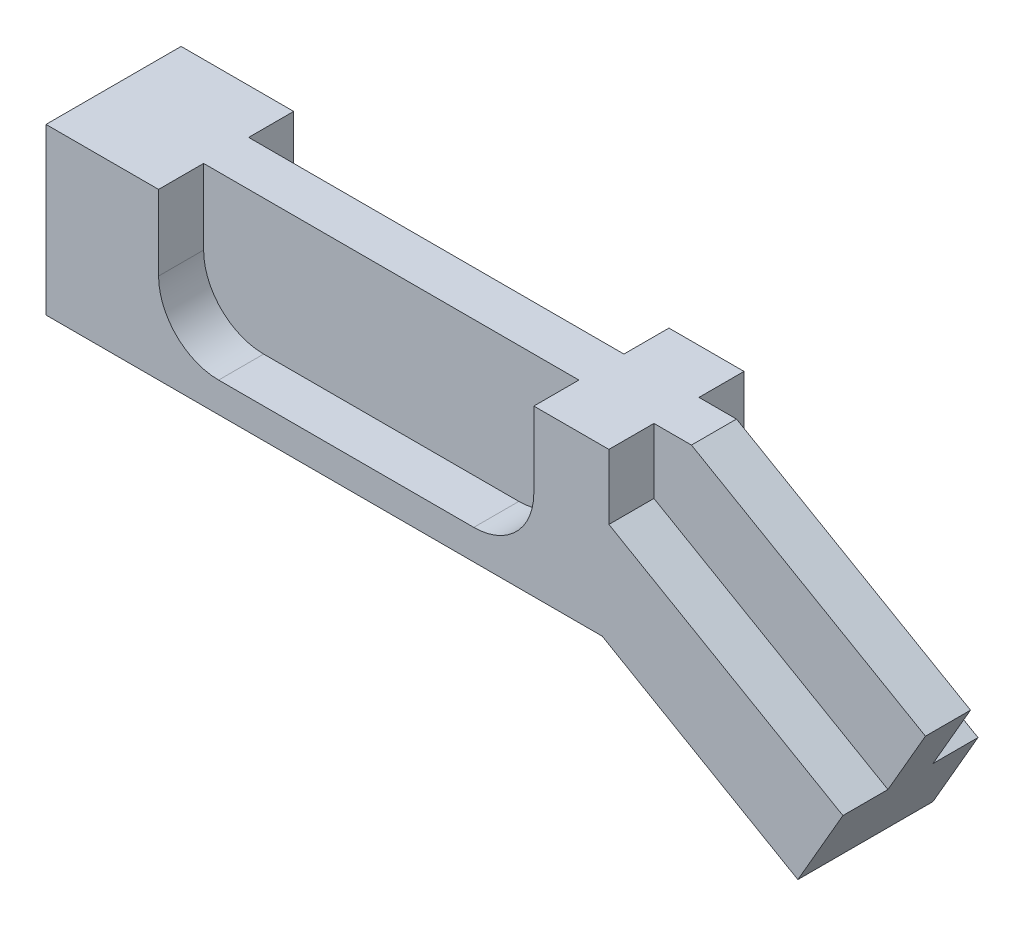
ISO-10303-21;
HEADER;
FILE_DESCRIPTION(('STEP AP214'),'2;1');
FILE_NAME('part.step','',(''),(''),'','','');
FILE_SCHEMA(('AUTOMOTIVE_DESIGN { 1 0 10303 214 1 1 1 1 }'));
ENDSEC;
DATA;
#1=APPLICATION_CONTEXT('core data for automotive mechanical design processes');
#2=APPLICATION_PROTOCOL_DEFINITION('international standard','automotive_design',2000,#1);
#3=PRODUCT_CONTEXT('',#1,'mechanical');
#4=PRODUCT('Part','Part','',(#3));
#5=PRODUCT_RELATED_PRODUCT_CATEGORY('part','',(#4));
#6=PRODUCT_DEFINITION_FORMATION('','',#4);
#7=PRODUCT_DEFINITION_CONTEXT('part definition',#1,'design');
#8=PRODUCT_DEFINITION('design','',#6,#7);
#9=PRODUCT_DEFINITION_SHAPE('','',#8);
#10=(LENGTH_UNIT() NAMED_UNIT(*) SI_UNIT(.MILLI.,.METRE.));
#11=(NAMED_UNIT(*) PLANE_ANGLE_UNIT() SI_UNIT($,.RADIAN.));
#12=(NAMED_UNIT(*) SI_UNIT($,.STERADIAN.) SOLID_ANGLE_UNIT());
#13=UNCERTAINTY_MEASURE_WITH_UNIT(LENGTH_MEASURE(1.E-05),#10,'distance_accuracy_value','');
#14=(GEOMETRIC_REPRESENTATION_CONTEXT(3) GLOBAL_UNCERTAINTY_ASSIGNED_CONTEXT((#13)) GLOBAL_UNIT_ASSIGNED_CONTEXT((#10,
#11,#12)) REPRESENTATION_CONTEXT('',''));
#15=CARTESIAN_POINT('',(0.,0.,0.));
#16=DIRECTION('',(0.,0.,1.));
#17=DIRECTION('',(1.,0.,0.));
#18=AXIS2_PLACEMENT_3D('',#15,#16,#17);
#19=CARTESIAN_POINT('',(15.0000000000001,25.9807621135332,9.));
#20=DIRECTION('',(-0.500000000000001,-0.866025403784438,0.));
#21=DIRECTION('',(0.866025403784438,-0.500000000000001,0.));
#22=AXIS2_PLACEMENT_3D('',#19,#20,#21);
#23=PLANE('',#22);
#24=DIRECTION('',(-0.866025403784438,0.500000000000001,0.));
#25=VECTOR('',#24,1.);
#26=CARTESIAN_POINT('',(15.0000000000001,25.9807621135332,-3.));
#27=LINE('',#26,#25);
#28=CARTESIAN_POINT('',(106.17691453624,-26.6602540378444,-3.));
#29=VERTEX_POINT('',#28);
#30=CARTESIAN_POINT('',(75.,-8.66025403784439,-3.));
#31=VERTEX_POINT('',#30);
#32=EDGE_CURVE('E462',#29,#31,#27,.T.);
#33=ORIENTED_EDGE('',*,*,#32,.F.);
#34=DIRECTION('',(0.,0.,-1.));
#35=VECTOR('',#34,1.);
#36=CARTESIAN_POINT('',(106.17691453624,-26.6602540378444,9.));
#37=LINE('',#36,#35);
#38=CARTESIAN_POINT('',(106.17691453624,-26.6602540378444,-9.));
#39=VERTEX_POINT('',#38);
#40=EDGE_CURVE('E222',#29,#39,#37,.T.);
#41=ORIENTED_EDGE('',*,*,#40,.T.);
#42=DIRECTION('',(-0.866025403784438,0.500000000000001,0.));
#43=VECTOR('',#42,1.);
#44=CARTESIAN_POINT('',(15.0000000000001,25.9807621135332,-9.));
#45=LINE('',#44,#43);
#46=CARTESIAN_POINT('',(75.,-8.66025403784439,-9.));
#47=VERTEX_POINT('',#46);
#48=EDGE_CURVE('E289',#39,#47,#45,.T.);
#49=ORIENTED_EDGE('',*,*,#48,.T.);
#50=DIRECTION('',(0.,0.,-1.));
#51=VECTOR('',#50,1.);
#52=CARTESIAN_POINT('',(75.,-8.66025403784439,9.));
#53=LINE('',#52,#51);
#54=EDGE_CURVE('E308',#31,#47,#53,.T.);
#55=ORIENTED_EDGE('',*,*,#54,.F.);
#56=EDGE_LOOP('',(#33,#41,#49,#55));
#57=FACE_BOUND('',#56,.T.);
#58=ADVANCED_FACE('F32',(#57),#23,.F.);
#59=CARTESIAN_POINT('',(75.,0.,9.));
#60=DIRECTION('',(1.,0.,0.));
#61=DIRECTION('',(0.,0.,-1.));
#62=AXIS2_PLACEMENT_3D('',#59,#60,#61);
#63=PLANE('',#62);
#64=DIRECTION('',(0.,0.,-1.));
#65=VECTOR('',#64,1.);
#66=CARTESIAN_POINT('',(75.,0.,9.));
#67=LINE('',#66,#65);
#68=CARTESIAN_POINT('',(75.,0.,-3.));
#69=VERTEX_POINT('',#68);
#70=CARTESIAN_POINT('',(75.,0.,-9.));
#71=VERTEX_POINT('',#70);
#72=EDGE_CURVE('E305',#69,#71,#67,.T.);
#73=ORIENTED_EDGE('',*,*,#72,.F.);
#74=DIRECTION('',(0.,-1.,0.));
#75=VECTOR('',#74,1.);
#76=CARTESIAN_POINT('',(75.,0.,-3.));
#77=LINE('',#76,#75);
#78=EDGE_CURVE('E206',#69,#31,#77,.T.);
#79=ORIENTED_EDGE('',*,*,#78,.T.);
#80=ORIENTED_EDGE('',*,*,#54,.T.);
#81=DIRECTION('',(0.,-1.,0.));
#82=VECTOR('',#81,1.);
#83=CARTESIAN_POINT('',(75.,0.,-9.));
#84=LINE('',#83,#82);
#85=EDGE_CURVE('E292',#71,#47,#84,.T.);
#86=ORIENTED_EDGE('',*,*,#85,.F.);
#87=EDGE_LOOP('',(#73,#79,#80,#86));
#88=FACE_BOUND('',#87,.T.);
#89=ADVANCED_FACE('F319',(#88),#63,.T.);
#90=CARTESIAN_POINT('',(57.,-10.,9.));
#91=DIRECTION('',(0.,0.,-1.));
#92=DIRECTION('',(-1.,0.,0.));
#93=AXIS2_PLACEMENT_3D('',#90,#91,#92);
#94=CYLINDRICAL_SURFACE('',#93,8.);
#95=DIRECTION('',(0.,0.,-1.));
#96=VECTOR('',#95,1.);
#97=CARTESIAN_POINT('',(56.9999999999999,-18.,9.));
#98=LINE('',#97,#96);
#99=CARTESIAN_POINT('',(56.9999999999999,-18.,-3.));
#100=VERTEX_POINT('',#99);
#101=CARTESIAN_POINT('',(56.9999999999999,-18.,-9.));
#102=VERTEX_POINT('',#101);
#103=EDGE_CURVE('E40',#100,#102,#98,.T.);
#104=ORIENTED_EDGE('',*,*,#103,.F.);
#105=CARTESIAN_POINT('',(57.,-10.,-3.));
#106=DIRECTION('',(0.,0.,1.));
#107=DIRECTION('',(1.,0.,0.));
#108=AXIS2_PLACEMENT_3D('',#105,#106,#107);
#109=CIRCLE('',#108,8.);
#110=CARTESIAN_POINT('',(65.,-9.99999999999994,-3.));
#111=VERTEX_POINT('',#110);
#112=EDGE_CURVE('E338',#100,#111,#109,.T.);
#113=ORIENTED_EDGE('',*,*,#112,.T.);
#114=DIRECTION('',(0.,0.,-1.));
#115=VECTOR('',#114,1.);
#116=CARTESIAN_POINT('',(65.,-9.99999999999994,9.));
#117=LINE('',#116,#115);
#118=CARTESIAN_POINT('',(65.,-9.99999999999994,-9.));
#119=VERTEX_POINT('',#118);
#120=EDGE_CURVE('E303',#111,#119,#117,.T.);
#121=ORIENTED_EDGE('',*,*,#120,.T.);
#122=CARTESIAN_POINT('',(57.,-10.,-9.));
#123=DIRECTION('',(0.,0.,1.));
#124=DIRECTION('',(1.,0.,0.));
#125=AXIS2_PLACEMENT_3D('',#122,#123,#124);
#126=CIRCLE('',#125,8.);
#127=EDGE_CURVE('E265',#102,#119,#126,.T.);
#128=ORIENTED_EDGE('',*,*,#127,.F.);
#129=EDGE_LOOP('',(#104,#113,#121,#128));
#130=FACE_BOUND('',#129,.T.);
#131=ADVANCED_FACE('F383',(#130),#94,.F.);
#132=CARTESIAN_POINT('',(0.,-18.,9.));
#133=DIRECTION('',(0.,1.,0.));
#134=DIRECTION('',(-1.,0.,0.));
#135=AXIS2_PLACEMENT_3D('',#132,#133,#134);
#136=PLANE('',#135);
#137=DIRECTION('',(0.,0.,-1.));
#138=VECTOR('',#137,1.);
#139=CARTESIAN_POINT('',(23.0000000000001,-18.,9.));
#140=LINE('',#139,#138);
#141=CARTESIAN_POINT('',(23.0000000000001,-18.,-3.));
#142=VERTEX_POINT('',#141);
#143=CARTESIAN_POINT('',(23.0000000000001,-18.,-9.));
#144=VERTEX_POINT('',#143);
#145=EDGE_CURVE('E243',#142,#144,#140,.T.);
#146=ORIENTED_EDGE('',*,*,#145,.F.);
#147=DIRECTION('',(1.,0.,0.));
#148=VECTOR('',#147,1.);
#149=CARTESIAN_POINT('',(0.,-18.,-3.));
#150=LINE('',#149,#148);
#151=EDGE_CURVE('E55',#142,#100,#150,.T.);
#152=ORIENTED_EDGE('',*,*,#151,.T.);
#153=ORIENTED_EDGE('',*,*,#103,.T.);
#154=DIRECTION('',(1.,0.,0.));
#155=VECTOR('',#154,1.);
#156=CARTESIAN_POINT('',(0.,-18.,-9.));
#157=LINE('',#156,#155);
#158=EDGE_CURVE('E260',#144,#102,#157,.T.);
#159=ORIENTED_EDGE('',*,*,#158,.F.);
#160=EDGE_LOOP('',(#146,#152,#153,#159));
#161=FACE_BOUND('',#160,.T.);
#162=ADVANCED_FACE('F261',(#161),#136,.T.);
#163=CARTESIAN_POINT('',(23.,-10.,9.));
#164=DIRECTION('',(0.,0.,-1.));
#165=DIRECTION('',(-1.,0.,0.));
#166=AXIS2_PLACEMENT_3D('',#163,#164,#165);
#167=CYLINDRICAL_SURFACE('',#166,8.);
#168=DIRECTION('',(0.,0.,-1.));
#169=VECTOR('',#168,1.);
#170=CARTESIAN_POINT('',(15.,-9.99999999999994,9.));
#171=LINE('',#170,#169);
#172=CARTESIAN_POINT('',(15.,-9.99999999999994,-3.));
#173=VERTEX_POINT('',#172);
#174=CARTESIAN_POINT('',(15.,-9.99999999999994,-9.));
#175=VERTEX_POINT('',#174);
#176=EDGE_CURVE('E240',#173,#175,#171,.T.);
#177=ORIENTED_EDGE('',*,*,#176,.F.);
#178=CARTESIAN_POINT('',(23.,-10.,-3.));
#179=DIRECTION('',(0.,0.,1.));
#180=DIRECTION('',(1.,0.,0.));
#181=AXIS2_PLACEMENT_3D('',#178,#179,#180);
#182=CIRCLE('',#181,8.);
#183=EDGE_CURVE('E258',#173,#142,#182,.T.);
#184=ORIENTED_EDGE('',*,*,#183,.T.);
#185=ORIENTED_EDGE('',*,*,#145,.T.);
#186=CARTESIAN_POINT('',(23.,-10.,-9.));
#187=DIRECTION('',(0.,0.,1.));
#188=DIRECTION('',(1.,0.,0.));
#189=AXIS2_PLACEMENT_3D('',#186,#187,#188);
#190=CIRCLE('',#189,8.);
#191=EDGE_CURVE('E255',#175,#144,#190,.T.);
#192=ORIENTED_EDGE('',*,*,#191,.F.);
#193=EDGE_LOOP('',(#177,#184,#185,#192));
#194=FACE_BOUND('',#193,.T.);
#195=ADVANCED_FACE('F253',(#194),#167,.F.);
#196=CARTESIAN_POINT('',(15.,0.,9.));
#197=DIRECTION('',(1.,0.,0.));
#198=DIRECTION('',(0.,1.,0.));
#199=AXIS2_PLACEMENT_3D('',#196,#197,#198);
#200=PLANE('',#199);
#201=DIRECTION('',(0.,0.,-1.));
#202=VECTOR('',#201,1.);
#203=CARTESIAN_POINT('',(15.,0.,9.));
#204=LINE('',#203,#202);
#205=CARTESIAN_POINT('',(15.,0.,-3.));
#206=VERTEX_POINT('',#205);
#207=CARTESIAN_POINT('',(15.,0.,-9.));
#208=VERTEX_POINT('',#207);
#209=EDGE_CURVE('E236',#206,#208,#204,.T.);
#210=ORIENTED_EDGE('',*,*,#209,.F.);
#211=DIRECTION('',(0.,-1.,0.));
#212=VECTOR('',#211,1.);
#213=CARTESIAN_POINT('',(15.,0.,-3.));
#214=LINE('',#213,#212);
#215=EDGE_CURVE('E335',#206,#173,#214,.T.);
#216=ORIENTED_EDGE('',*,*,#215,.T.);
#217=ORIENTED_EDGE('',*,*,#176,.T.);
#218=DIRECTION('',(0.,-1.,0.));
#219=VECTOR('',#218,1.);
#220=CARTESIAN_POINT('',(15.,0.,-9.));
#221=LINE('',#220,#219);
#222=EDGE_CURVE('E270',#208,#175,#221,.T.);
#223=ORIENTED_EDGE('',*,*,#222,.F.);
#224=EDGE_LOOP('',(#210,#216,#217,#223));
#225=FACE_BOUND('',#224,.T.);
#226=ADVANCED_FACE('F427',(#225),#200,.T.);
#227=CARTESIAN_POINT('',(65.,0.,9.));
#228=DIRECTION('',(1.,0.,0.));
#229=DIRECTION('',(0.,0.,-1.));
#230=AXIS2_PLACEMENT_3D('',#227,#228,#229);
#231=PLANE('',#230);
#232=DIRECTION('',(0.,-1.,0.));
#233=VECTOR('',#232,1.);
#234=CARTESIAN_POINT('',(65.,0.,-3.));
#235=LINE('',#234,#233);
#236=CARTESIAN_POINT('',(65.,0.,-3.));
#237=VERTEX_POINT('',#236);
#238=EDGE_CURVE('E327',#237,#111,#235,.T.);
#239=ORIENTED_EDGE('',*,*,#238,.F.);
#240=DIRECTION('',(0.,0.,-1.));
#241=VECTOR('',#240,1.);
#242=CARTESIAN_POINT('',(65.,0.,9.));
#243=LINE('',#242,#241);
#244=CARTESIAN_POINT('',(65.,0.,-9.));
#245=VERTEX_POINT('',#244);
#246=EDGE_CURVE('E302',#237,#245,#243,.T.);
#247=ORIENTED_EDGE('',*,*,#246,.T.);
#248=DIRECTION('',(0.,-1.,0.));
#249=VECTOR('',#248,1.);
#250=CARTESIAN_POINT('',(65.,0.,-9.));
#251=LINE('',#250,#249);
#252=EDGE_CURVE('E295',#245,#119,#251,.T.);
#253=ORIENTED_EDGE('',*,*,#252,.T.);
#254=ORIENTED_EDGE('',*,*,#120,.F.);
#255=EDGE_LOOP('',(#239,#247,#253,#254));
#256=FACE_BOUND('',#255,.T.);
#257=ADVANCED_FACE('F324',(#256),#231,.F.);
#258=CARTESIAN_POINT('',(57.,-10.,3.));
#259=DIRECTION('',(0.,0.,1.));
#260=DIRECTION('',(1.,0.,0.));
#261=AXIS2_PLACEMENT_3D('',#258,#259,#260);
#262=CIRCLE('',#261,8.);
#263=CARTESIAN_POINT('',(56.9999999999999,-18.,3.));
#264=VERTEX_POINT('',#263);
#265=CARTESIAN_POINT('',(65.,-9.99999999999994,3.));
#266=VERTEX_POINT('',#265);
#267=EDGE_CURVE('E435',#264,#266,#262,.T.);
#268=ORIENTED_EDGE('',*,*,#267,.F.);
#269=CARTESIAN_POINT('',(56.9999999999999,-18.,9.));
#270=VERTEX_POINT('',#269);
#271=EDGE_CURVE('E11',#270,#264,#98,.T.);
#272=ORIENTED_EDGE('',*,*,#271,.F.);
#273=CARTESIAN_POINT('',(57.,-10.,9.));
#274=DIRECTION('',(0.,0.,1.));
#275=DIRECTION('',(1.,0.,0.));
#276=AXIS2_PLACEMENT_3D('',#273,#274,#275);
#277=CIRCLE('',#276,8.);
#278=CARTESIAN_POINT('',(65.,-9.99999999999994,9.));
#279=VERTEX_POINT('',#278);
#280=EDGE_CURVE('E298',#270,#279,#277,.T.);
#281=ORIENTED_EDGE('',*,*,#280,.T.);
#282=EDGE_CURVE('E299',#279,#266,#117,.T.);
#283=ORIENTED_EDGE('',*,*,#282,.T.);
#284=EDGE_LOOP('',(#268,#272,#281,#283));
#285=FACE_BOUND('',#284,.T.);
#286=ADVANCED_FACE('F34',(#285),#94,.F.);
#287=DIRECTION('',(1.,0.,0.));
#288=VECTOR('',#287,1.);
#289=CARTESIAN_POINT('',(0.,-18.,3.));
#290=LINE('',#289,#288);
#291=CARTESIAN_POINT('',(23.0000000000001,-18.,3.));
#292=VERTEX_POINT('',#291);
#293=EDGE_CURVE('E343',#292,#264,#290,.T.);
#294=ORIENTED_EDGE('',*,*,#293,.F.);
#295=CARTESIAN_POINT('',(23.0000000000001,-18.,9.));
#296=VERTEX_POINT('',#295);
#297=EDGE_CURVE('E244',#296,#292,#140,.T.);
#298=ORIENTED_EDGE('',*,*,#297,.F.);
#299=DIRECTION('',(1.,0.,0.));
#300=VECTOR('',#299,1.);
#301=CARTESIAN_POINT('',(0.,-18.,9.));
#302=LINE('',#301,#300);
#303=EDGE_CURVE('E346',#296,#270,#302,.T.);
#304=ORIENTED_EDGE('',*,*,#303,.T.);
#305=ORIENTED_EDGE('',*,*,#271,.T.);
#306=EDGE_LOOP('',(#294,#298,#304,#305));
#307=FACE_BOUND('',#306,.T.);
#308=ADVANCED_FACE('F389',(#307),#136,.T.);
#309=CARTESIAN_POINT('',(23.,-10.,3.));
#310=DIRECTION('',(0.,0.,1.));
#311=DIRECTION('',(1.,0.,0.));
#312=AXIS2_PLACEMENT_3D('',#309,#310,#311);
#313=CIRCLE('',#312,8.);
#314=CARTESIAN_POINT('',(15.,-9.99999999999994,3.));
#315=VERTEX_POINT('',#314);
#316=EDGE_CURVE('E372',#315,#292,#313,.T.);
#317=ORIENTED_EDGE('',*,*,#316,.F.);
#318=CARTESIAN_POINT('',(15.,-9.99999999999994,9.));
#319=VERTEX_POINT('',#318);
#320=EDGE_CURVE('E241',#319,#315,#171,.T.);
#321=ORIENTED_EDGE('',*,*,#320,.F.);
#322=CARTESIAN_POINT('',(23.,-10.,9.));
#323=DIRECTION('',(0.,0.,1.));
#324=DIRECTION('',(1.,0.,0.));
#325=AXIS2_PLACEMENT_3D('',#322,#323,#324);
#326=CIRCLE('',#325,8.);
#327=EDGE_CURVE('E349',#319,#296,#326,.T.);
#328=ORIENTED_EDGE('',*,*,#327,.T.);
#329=ORIENTED_EDGE('',*,*,#297,.T.);
#330=EDGE_LOOP('',(#317,#321,#328,#329));
#331=FACE_BOUND('',#330,.T.);
#332=ADVANCED_FACE('F425',(#331),#167,.F.);
#333=DIRECTION('',(0.,-1.,0.));
#334=VECTOR('',#333,1.);
#335=CARTESIAN_POINT('',(15.,0.,3.));
#336=LINE('',#335,#334);
#337=CARTESIAN_POINT('',(15.,0.,3.));
#338=VERTEX_POINT('',#337);
#339=EDGE_CURVE('E373',#338,#315,#336,.T.);
#340=ORIENTED_EDGE('',*,*,#339,.F.);
#341=CARTESIAN_POINT('',(15.,0.,9.));
#342=VERTEX_POINT('',#341);
#343=EDGE_CURVE('E237',#342,#338,#204,.T.);
#344=ORIENTED_EDGE('',*,*,#343,.F.);
#345=DIRECTION('',(0.,-1.,0.));
#346=VECTOR('',#345,1.);
#347=CARTESIAN_POINT('',(15.,0.,9.));
#348=LINE('',#347,#346);
#349=EDGE_CURVE('E351',#342,#319,#348,.T.);
#350=ORIENTED_EDGE('',*,*,#349,.T.);
#351=ORIENTED_EDGE('',*,*,#320,.T.);
#352=EDGE_LOOP('',(#340,#344,#350,#351));
#353=FACE_BOUND('',#352,.T.);
#354=ADVANCED_FACE('F421',(#353),#200,.T.);
#355=CARTESIAN_POINT('',(0.,0.,9.));
#356=DIRECTION('',(1.,0.,0.));
#357=DIRECTION('',(0.,1.,0.));
#358=AXIS2_PLACEMENT_3D('',#355,#356,#357);
#359=PLANE('',#358);
#360=DIRECTION('',(0.,-1.,0.));
#361=VECTOR('',#360,1.);
#362=CARTESIAN_POINT('',(0.,0.,-9.));
#363=LINE('',#362,#361);
#364=CARTESIAN_POINT('',(0.,0.,-9.));
#365=VERTEX_POINT('',#364);
#366=CARTESIAN_POINT('',(0.,-22.,-9.));
#367=VERTEX_POINT('',#366);
#368=EDGE_CURVE('E277',#365,#367,#363,.T.);
#369=ORIENTED_EDGE('',*,*,#368,.T.);
#370=DIRECTION('',(0.,0.,-1.));
#371=VECTOR('',#370,1.);
#372=CARTESIAN_POINT('',(0.,-22.,9.));
#373=LINE('',#372,#371);
#374=CARTESIAN_POINT('',(0.,-22.,9.));
#375=VERTEX_POINT('',#374);
#376=EDGE_CURVE('E231',#375,#367,#373,.T.);
#377=ORIENTED_EDGE('',*,*,#376,.F.);
#378=DIRECTION('',(0.,-1.,0.));
#379=VECTOR('',#378,1.);
#380=CARTESIAN_POINT('',(0.,0.,9.));
#381=LINE('',#380,#379);
#382=CARTESIAN_POINT('',(0.,0.,9.));
#383=VERTEX_POINT('',#382);
#384=EDGE_CURVE('E357',#383,#375,#381,.T.);
#385=ORIENTED_EDGE('',*,*,#384,.F.);
#386=DIRECTION('',(0.,0.,-1.));
#387=VECTOR('',#386,1.);
#388=CARTESIAN_POINT('',(0.,0.,9.));
#389=LINE('',#388,#387);
#390=EDGE_CURVE('E234',#383,#365,#389,.T.);
#391=ORIENTED_EDGE('',*,*,#390,.T.);
#392=EDGE_LOOP('',(#369,#377,#385,#391));
#393=FACE_BOUND('',#392,.T.);
#394=ADVANCED_FACE('F417',(#393),#359,.F.);
#395=CARTESIAN_POINT('',(0.,-22.,9.));
#396=DIRECTION('',(0.,1.,0.));
#397=DIRECTION('',(-1.,0.,0.));
#398=AXIS2_PLACEMENT_3D('',#395,#396,#397);
#399=PLANE('',#398);
#400=DIRECTION('',(1.,0.,0.));
#401=VECTOR('',#400,1.);
#402=CARTESIAN_POINT('',(0.,-22.,-9.));
#403=LINE('',#402,#401);
#404=CARTESIAN_POINT('',(74.1051177665152,-22.,-9.));
#405=VERTEX_POINT('',#404);
#406=EDGE_CURVE('E280',#367,#405,#403,.T.);
#407=ORIENTED_EDGE('',*,*,#406,.T.);
#408=DIRECTION('',(0.,0.,-1.));
#409=VECTOR('',#408,1.);
#410=CARTESIAN_POINT('',(74.1051177665152,-22.,9.));
#411=LINE('',#410,#409);
#412=CARTESIAN_POINT('',(74.1051177665152,-22.,9.));
#413=VERTEX_POINT('',#412);
#414=EDGE_CURVE('E224',#413,#405,#411,.T.);
#415=ORIENTED_EDGE('',*,*,#414,.F.);
#416=DIRECTION('',(1.,0.,0.));
#417=VECTOR('',#416,1.);
#418=CARTESIAN_POINT('',(0.,-22.,9.));
#419=LINE('',#418,#417);
#420=EDGE_CURVE('E360',#375,#413,#419,.T.);
#421=ORIENTED_EDGE('',*,*,#420,.F.);
#422=ORIENTED_EDGE('',*,*,#376,.T.);
#423=EDGE_LOOP('',(#407,#415,#421,#422));
#424=FACE_BOUND('',#423,.T.);
#425=ADVANCED_FACE('F411',(#424),#399,.F.);
#426=CARTESIAN_POINT('',(8.99999999999995,15.5884572681198,9.));
#427=DIRECTION('',(-0.5,-0.866025403784439,0.));
#428=DIRECTION('',(0.866025403784439,-0.5,0.));
#429=AXIS2_PLACEMENT_3D('',#426,#427,#428);
#430=PLANE('',#429);
#431=DIRECTION('',(-0.866025403784439,0.5,0.));
#432=VECTOR('',#431,1.);
#433=CARTESIAN_POINT('',(8.99999999999995,15.5884572681198,-9.));
#434=LINE('',#433,#432);
#435=CARTESIAN_POINT('',(100.17691453624,-37.0525588832577,-9.));
#436=VERTEX_POINT('',#435);
#437=EDGE_CURVE('E283',#436,#405,#434,.T.);
#438=ORIENTED_EDGE('',*,*,#437,.F.);
#439=DIRECTION('',(0.,0.,-1.));
#440=VECTOR('',#439,1.);
#441=CARTESIAN_POINT('',(100.17691453624,-37.0525588832577,9.));
#442=LINE('',#441,#440);
#443=CARTESIAN_POINT('',(100.17691453624,-37.0525588832577,9.));
#444=VERTEX_POINT('',#443);
#445=EDGE_CURVE('E221',#444,#436,#442,.T.);
#446=ORIENTED_EDGE('',*,*,#445,.F.);
#447=DIRECTION('',(-0.866025403784439,0.5,0.));
#448=VECTOR('',#447,1.);
#449=CARTESIAN_POINT('',(8.99999999999995,15.5884572681198,9.));
#450=LINE('',#449,#448);
#451=EDGE_CURVE('E362',#444,#413,#450,.T.);
#452=ORIENTED_EDGE('',*,*,#451,.T.);
#453=ORIENTED_EDGE('',*,*,#414,.T.);
#454=EDGE_LOOP('',(#438,#446,#452,#453));
#455=FACE_BOUND('',#454,.T.);
#456=ADVANCED_FACE('F407',(#455),#430,.T.);
#457=CARTESIAN_POINT('',(91.1769145362397,-52.6410161513776,9.));
#458=DIRECTION('',(0.866025403784438,-0.500000000000001,0.));
#459=DIRECTION('',(0.500000000000001,0.866025403784438,0.));
#460=AXIS2_PLACEMENT_3D('',#457,#458,#459);
#461=PLANE('',#460);
#462=DIRECTION('',(-0.500000000000001,-0.866025403784438,0.));
#463=VECTOR('',#462,1.);
#464=CARTESIAN_POINT('',(91.1769145362397,-52.6410161513776,-9.));
#465=LINE('',#464,#463);
#466=EDGE_CURVE('E286',#39,#436,#465,.T.);
#467=ORIENTED_EDGE('',*,*,#466,.F.);
#468=ORIENTED_EDGE('',*,*,#40,.F.);
#469=DIRECTION('',(-0.500000000000001,-0.866025403784438,0.));
#470=VECTOR('',#469,1.);
#471=CARTESIAN_POINT('',(91.1769145362397,-52.6410161513776,-3.));
#472=LINE('',#471,#470);
#473=CARTESIAN_POINT('',(111.17691453624,-18.,-3.));
#474=VERTEX_POINT('',#473);
#475=EDGE_CURVE('E464',#474,#29,#472,.T.);
#476=ORIENTED_EDGE('',*,*,#475,.F.);
#477=DIRECTION('',(0.,0.,-1.));
#478=VECTOR('',#477,1.);
#479=CARTESIAN_POINT('',(111.17691453624,-18.,3.));
#480=LINE('',#479,#478);
#481=CARTESIAN_POINT('',(111.17691453624,-18.,3.));
#482=VERTEX_POINT('',#481);
#483=EDGE_CURVE('E215',#482,#474,#480,.T.);
#484=ORIENTED_EDGE('',*,*,#483,.F.);
#485=DIRECTION('',(-0.500000000000001,-0.866025403784438,0.));
#486=VECTOR('',#485,1.);
#487=CARTESIAN_POINT('',(91.1769145362397,-52.6410161513776,3.));
#488=LINE('',#487,#486);
#489=CARTESIAN_POINT('',(106.17691453624,-26.6602540378444,3.));
#490=VERTEX_POINT('',#489);
#491=EDGE_CURVE('E198',#482,#490,#488,.T.);
#492=ORIENTED_EDGE('',*,*,#491,.T.);
#493=CARTESIAN_POINT('',(106.17691453624,-26.6602540378444,9.));
#494=VERTEX_POINT('',#493);
#495=EDGE_CURVE('E212',#494,#490,#37,.T.);
#496=ORIENTED_EDGE('',*,*,#495,.F.);
#497=DIRECTION('',(-0.500000000000001,-0.866025403784438,0.));
#498=VECTOR('',#497,1.);
#499=CARTESIAN_POINT('',(91.1769145362397,-52.6410161513776,9.));
#500=LINE('',#499,#498);
#501=EDGE_CURVE('E365',#494,#444,#500,.T.);
#502=ORIENTED_EDGE('',*,*,#501,.T.);
#503=ORIENTED_EDGE('',*,*,#445,.T.);
#504=EDGE_LOOP('',(#467,#468,#476,#484,#492,#496,#502,#503));
#505=FACE_BOUND('',#504,.T.);
#506=ADVANCED_FACE('F210',(#505),#461,.T.);
#507=ORIENTED_EDGE('',*,*,#495,.T.);
#508=DIRECTION('',(-0.866025403784438,0.500000000000001,0.));
#509=VECTOR('',#508,1.);
#510=CARTESIAN_POINT('',(15.0000000000001,25.9807621135332,3.));
#511=LINE('',#510,#509);
#512=CARTESIAN_POINT('',(75.,-8.66025403784439,3.));
#513=VERTEX_POINT('',#512);
#514=EDGE_CURVE('E194',#490,#513,#511,.T.);
#515=ORIENTED_EDGE('',*,*,#514,.T.);
#516=CARTESIAN_POINT('',(75.,-8.66025403784439,9.));
#517=VERTEX_POINT('',#516);
#518=EDGE_CURVE('E226',#517,#513,#53,.T.);
#519=ORIENTED_EDGE('',*,*,#518,.F.);
#520=DIRECTION('',(-0.866025403784438,0.500000000000001,0.));
#521=VECTOR('',#520,1.);
#522=CARTESIAN_POINT('',(15.0000000000001,25.9807621135332,9.));
#523=LINE('',#522,#521);
#524=EDGE_CURVE('E219',#494,#517,#523,.T.);
#525=ORIENTED_EDGE('',*,*,#524,.F.);
#526=EDGE_LOOP('',(#507,#515,#519,#525));
#527=FACE_BOUND('',#526,.T.);
#528=ADVANCED_FACE('F218',(#527),#23,.F.);
#529=DIRECTION('',(0.,-1.,0.));
#530=VECTOR('',#529,1.);
#531=CARTESIAN_POINT('',(75.,0.,3.));
#532=LINE('',#531,#530);
#533=CARTESIAN_POINT('',(75.,0.,3.));
#534=VERTEX_POINT('',#533);
#535=EDGE_CURVE('E201',#534,#513,#532,.T.);
#536=ORIENTED_EDGE('',*,*,#535,.F.);
#537=CARTESIAN_POINT('',(75.,0.,9.));
#538=VERTEX_POINT('',#537);
#539=EDGE_CURVE('E306',#538,#534,#67,.T.);
#540=ORIENTED_EDGE('',*,*,#539,.F.);
#541=DIRECTION('',(0.,-1.,0.));
#542=VECTOR('',#541,1.);
#543=CARTESIAN_POINT('',(75.,0.,9.));
#544=LINE('',#543,#542);
#545=EDGE_CURVE('E368',#538,#517,#544,.T.);
#546=ORIENTED_EDGE('',*,*,#545,.T.);
#547=ORIENTED_EDGE('',*,*,#518,.T.);
#548=EDGE_LOOP('',(#536,#540,#546,#547));
#549=FACE_BOUND('',#548,.T.);
#550=ADVANCED_FACE('F391',(#549),#63,.T.);
#551=CARTESIAN_POINT('',(0.,0.,9.));
#552=DIRECTION('',(0.,1.,0.));
#553=DIRECTION('',(0.,0.,1.));
#554=AXIS2_PLACEMENT_3D('',#551,#552,#553);
#555=PLANE('',#554);
#556=DIRECTION('',(1.,0.,0.));
#557=VECTOR('',#556,1.);
#558=CARTESIAN_POINT('',(0.,0.,-9.));
#559=LINE('',#558,#557);
#560=EDGE_CURVE('E278',#245,#71,#559,.T.);
#561=ORIENTED_EDGE('',*,*,#560,.F.);
#562=ORIENTED_EDGE('',*,*,#246,.F.);
#563=DIRECTION('',(1.,0.,0.));
#564=VECTOR('',#563,1.);
#565=CARTESIAN_POINT('',(0.,0.,-3.));
#566=LINE('',#565,#564);
#567=EDGE_CURVE('E330',#206,#237,#566,.T.);
#568=ORIENTED_EDGE('',*,*,#567,.F.);
#569=ORIENTED_EDGE('',*,*,#209,.T.);
#570=EDGE_CURVE('E272',#365,#208,#559,.T.);
#571=ORIENTED_EDGE('',*,*,#570,.F.);
#572=ORIENTED_EDGE('',*,*,#390,.F.);
#573=DIRECTION('',(1.,0.,0.));
#574=VECTOR('',#573,1.);
#575=CARTESIAN_POINT('',(0.,0.,9.));
#576=LINE('',#575,#574);
#577=EDGE_CURVE('E354',#383,#342,#576,.T.);
#578=ORIENTED_EDGE('',*,*,#577,.T.);
#579=ORIENTED_EDGE('',*,*,#343,.T.);
#580=DIRECTION('',(1.,0.,0.));
#581=VECTOR('',#580,1.);
#582=CARTESIAN_POINT('',(0.,0.,3.));
#583=LINE('',#582,#581);
#584=CARTESIAN_POINT('',(65.,0.,3.));
#585=VERTEX_POINT('',#584);
#586=EDGE_CURVE('E378',#338,#585,#583,.T.);
#587=ORIENTED_EDGE('',*,*,#586,.T.);
#588=CARTESIAN_POINT('',(65.,0.,9.));
#589=VERTEX_POINT('',#588);
#590=EDGE_CURVE('E304',#589,#585,#243,.T.);
#591=ORIENTED_EDGE('',*,*,#590,.F.);
#592=EDGE_CURVE('E358',#589,#538,#576,.T.);
#593=ORIENTED_EDGE('',*,*,#592,.T.);
#594=ORIENTED_EDGE('',*,*,#539,.T.);
#595=DIRECTION('',(1.,0.,0.));
#596=VECTOR('',#595,1.);
#597=CARTESIAN_POINT('',(0.,0.,3.));
#598=LINE('',#597,#596);
#599=CARTESIAN_POINT('',(80.,0.,3.));
#600=VERTEX_POINT('',#599);
#601=EDGE_CURVE('E457',#534,#600,#598,.T.);
#602=ORIENTED_EDGE('',*,*,#601,.T.);
#603=DIRECTION('',(0.,0.,-1.));
#604=VECTOR('',#603,1.);
#605=CARTESIAN_POINT('',(80.,0.,3.));
#606=LINE('',#605,#604);
#607=CARTESIAN_POINT('',(80.,0.,-3.));
#608=VERTEX_POINT('',#607);
#609=EDGE_CURVE('E456',#600,#608,#606,.T.);
#610=ORIENTED_EDGE('',*,*,#609,.T.);
#611=DIRECTION('',(1.,0.,0.));
#612=VECTOR('',#611,1.);
#613=CARTESIAN_POINT('',(0.,0.,-3.));
#614=LINE('',#613,#612);
#615=EDGE_CURVE('E47',#69,#608,#614,.T.);
#616=ORIENTED_EDGE('',*,*,#615,.F.);
#617=ORIENTED_EDGE('',*,*,#72,.T.);
#618=EDGE_LOOP('',(#561,#562,#568,#569,#571,#572,#578,#579,#587,#591,#593,#594,#602,#610,#616,#617));
#619=FACE_BOUND('',#618,.T.);
#620=ADVANCED_FACE('F314',(#619),#555,.T.);
#621=ORIENTED_EDGE('',*,*,#590,.T.);
#622=DIRECTION('',(0.,-1.,0.));
#623=VECTOR('',#622,1.);
#624=CARTESIAN_POINT('',(65.,0.,3.));
#625=LINE('',#624,#623);
#626=EDGE_CURVE('E437',#585,#266,#625,.T.);
#627=ORIENTED_EDGE('',*,*,#626,.T.);
#628=ORIENTED_EDGE('',*,*,#282,.F.);
#629=DIRECTION('',(0.,-1.,0.));
#630=VECTOR('',#629,1.);
#631=CARTESIAN_POINT('',(65.,0.,9.));
#632=LINE('',#631,#630);
#633=EDGE_CURVE('E371',#589,#279,#632,.T.);
#634=ORIENTED_EDGE('',*,*,#633,.F.);
#635=EDGE_LOOP('',(#621,#627,#628,#634));
#636=FACE_BOUND('',#635,.T.);
#637=ADVANCED_FACE('F449',(#636),#231,.F.);
#638=CARTESIAN_POINT('',(0.,0.,9.));
#639=DIRECTION('',(0.,0.,1.));
#640=DIRECTION('',(1.,0.,0.));
#641=AXIS2_PLACEMENT_3D('',#638,#639,#640);
#642=PLANE('',#641);
#643=ORIENTED_EDGE('',*,*,#280,.F.);
#644=ORIENTED_EDGE('',*,*,#303,.F.);
#645=ORIENTED_EDGE('',*,*,#327,.F.);
#646=ORIENTED_EDGE('',*,*,#349,.F.);
#647=ORIENTED_EDGE('',*,*,#577,.F.);
#648=ORIENTED_EDGE('',*,*,#384,.T.);
#649=ORIENTED_EDGE('',*,*,#420,.T.);
#650=ORIENTED_EDGE('',*,*,#451,.F.);
#651=ORIENTED_EDGE('',*,*,#501,.F.);
#652=ORIENTED_EDGE('',*,*,#524,.T.);
#653=ORIENTED_EDGE('',*,*,#545,.F.);
#654=ORIENTED_EDGE('',*,*,#592,.F.);
#655=ORIENTED_EDGE('',*,*,#633,.T.);
#656=EDGE_LOOP('',(#643,#644,#645,#646,#647,#648,#649,#650,#651,#652,#653,#654,#655));
#657=FACE_BOUND('',#656,.T.);
#658=ADVANCED_FACE('F452',(#657),#642,.T.);
#659=CARTESIAN_POINT('',(0.,0.,-9.));
#660=DIRECTION('',(0.,0.,1.));
#661=DIRECTION('',(1.,0.,0.));
#662=AXIS2_PLACEMENT_3D('',#659,#660,#661);
#663=PLANE('',#662);
#664=ORIENTED_EDGE('',*,*,#127,.T.);
#665=ORIENTED_EDGE('',*,*,#252,.F.);
#666=ORIENTED_EDGE('',*,*,#560,.T.);
#667=ORIENTED_EDGE('',*,*,#85,.T.);
#668=ORIENTED_EDGE('',*,*,#48,.F.);
#669=ORIENTED_EDGE('',*,*,#466,.T.);
#670=ORIENTED_EDGE('',*,*,#437,.T.);
#671=ORIENTED_EDGE('',*,*,#406,.F.);
#672=ORIENTED_EDGE('',*,*,#368,.F.);
#673=ORIENTED_EDGE('',*,*,#570,.T.);
#674=ORIENTED_EDGE('',*,*,#222,.T.);
#675=ORIENTED_EDGE('',*,*,#191,.T.);
#676=ORIENTED_EDGE('',*,*,#158,.T.);
#677=EDGE_LOOP('',(#664,#665,#666,#667,#668,#669,#670,#671,#672,#673,#674,#675,#676));
#678=FACE_BOUND('',#677,.T.);
#679=ADVANCED_FACE('F267',(#678),#663,.F.);
#680=CARTESIAN_POINT('',(0.,0.,3.));
#681=DIRECTION('',(0.,0.,1.));
#682=DIRECTION('',(1.,0.,0.));
#683=AXIS2_PLACEMENT_3D('',#680,#681,#682);
#684=PLANE('',#683);
#685=ORIENTED_EDGE('',*,*,#293,.T.);
#686=ORIENTED_EDGE('',*,*,#267,.T.);
#687=ORIENTED_EDGE('',*,*,#626,.F.);
#688=ORIENTED_EDGE('',*,*,#586,.F.);
#689=ORIENTED_EDGE('',*,*,#339,.T.);
#690=ORIENTED_EDGE('',*,*,#316,.T.);
#691=EDGE_LOOP('',(#685,#686,#687,#688,#689,#690));
#692=FACE_BOUND('',#691,.T.);
#693=ADVANCED_FACE('F446',(#692),#684,.T.);
#694=CARTESIAN_POINT('',(0.,0.,-3.));
#695=DIRECTION('',(0.,0.,1.));
#696=DIRECTION('',(1.,0.,0.));
#697=AXIS2_PLACEMENT_3D('',#694,#695,#696);
#698=PLANE('',#697);
#699=ORIENTED_EDGE('',*,*,#151,.F.);
#700=ORIENTED_EDGE('',*,*,#183,.F.);
#701=ORIENTED_EDGE('',*,*,#215,.F.);
#702=ORIENTED_EDGE('',*,*,#567,.T.);
#703=ORIENTED_EDGE('',*,*,#238,.T.);
#704=ORIENTED_EDGE('',*,*,#112,.F.);
#705=EDGE_LOOP('',(#699,#700,#701,#702,#703,#704));
#706=FACE_BOUND('',#705,.T.);
#707=ADVANCED_FACE('F333',(#706),#698,.F.);
#708=CARTESIAN_POINT('',(20.0000000000001,34.6410161513776,3.));
#709=DIRECTION('',(0.500000000000001,0.866025403784438,0.));
#710=DIRECTION('',(-0.866025403784438,0.500000000000001,0.));
#711=AXIS2_PLACEMENT_3D('',#708,#709,#710);
#712=PLANE('',#711);
#713=DIRECTION('',(0.866025403784438,-0.500000000000001,0.));
#714=VECTOR('',#713,1.);
#715=CARTESIAN_POINT('',(20.0000000000001,34.6410161513776,-3.));
#716=LINE('',#715,#714);
#717=EDGE_CURVE('E466',#608,#474,#716,.T.);
#718=ORIENTED_EDGE('',*,*,#717,.F.);
#719=ORIENTED_EDGE('',*,*,#609,.F.);
#720=DIRECTION('',(0.866025403784438,-0.500000000000001,0.));
#721=VECTOR('',#720,1.);
#722=CARTESIAN_POINT('',(20.0000000000001,34.6410161513776,3.));
#723=LINE('',#722,#721);
#724=EDGE_CURVE('E216',#600,#482,#723,.T.);
#725=ORIENTED_EDGE('',*,*,#724,.T.);
#726=ORIENTED_EDGE('',*,*,#483,.T.);
#727=EDGE_LOOP('',(#718,#719,#725,#726));
#728=FACE_BOUND('',#727,.T.);
#729=ADVANCED_FACE('F628',(#728),#712,.T.);
#730=CARTESIAN_POINT('',(0.,0.,3.));
#731=DIRECTION('',(0.,0.,1.));
#732=DIRECTION('',(1.,0.,0.));
#733=AXIS2_PLACEMENT_3D('',#730,#731,#732);
#734=PLANE('',#733);
#735=ORIENTED_EDGE('',*,*,#514,.F.);
#736=ORIENTED_EDGE('',*,*,#491,.F.);
#737=ORIENTED_EDGE('',*,*,#724,.F.);
#738=ORIENTED_EDGE('',*,*,#601,.F.);
#739=ORIENTED_EDGE('',*,*,#535,.T.);
#740=EDGE_LOOP('',(#735,#736,#737,#738,#739));
#741=FACE_BOUND('',#740,.T.);
#742=ADVANCED_FACE('F196',(#741),#734,.T.);
#743=CARTESIAN_POINT('',(0.,0.,-3.));
#744=DIRECTION('',(0.,0.,1.));
#745=DIRECTION('',(1.,0.,0.));
#746=AXIS2_PLACEMENT_3D('',#743,#744,#745);
#747=PLANE('',#746);
#748=ORIENTED_EDGE('',*,*,#32,.T.);
#749=ORIENTED_EDGE('',*,*,#78,.F.);
#750=ORIENTED_EDGE('',*,*,#615,.T.);
#751=ORIENTED_EDGE('',*,*,#717,.T.);
#752=ORIENTED_EDGE('',*,*,#475,.T.);
#753=EDGE_LOOP('',(#748,#749,#750,#751,#752));
#754=FACE_BOUND('',#753,.T.);
#755=ADVANCED_FACE('F646',(#754),#747,.F.);
#756=CLOSED_SHELL('',(#58,#89,#131,#162,#195,#226,#257,#286,#308,#332,#354,#394,#425,#456,#506,
#528,#550,#620,#637,#658,#679,#693,#707,#729,#742,#755));
#757=MANIFOLD_SOLID_BREP('B2',#756);
#758=ADVANCED_BREP_SHAPE_REPRESENTATION('',(#18,#757),#14);
#759=SHAPE_DEFINITION_REPRESENTATION(#9,#758);
ENDSEC;
END-ISO-10303-21;
